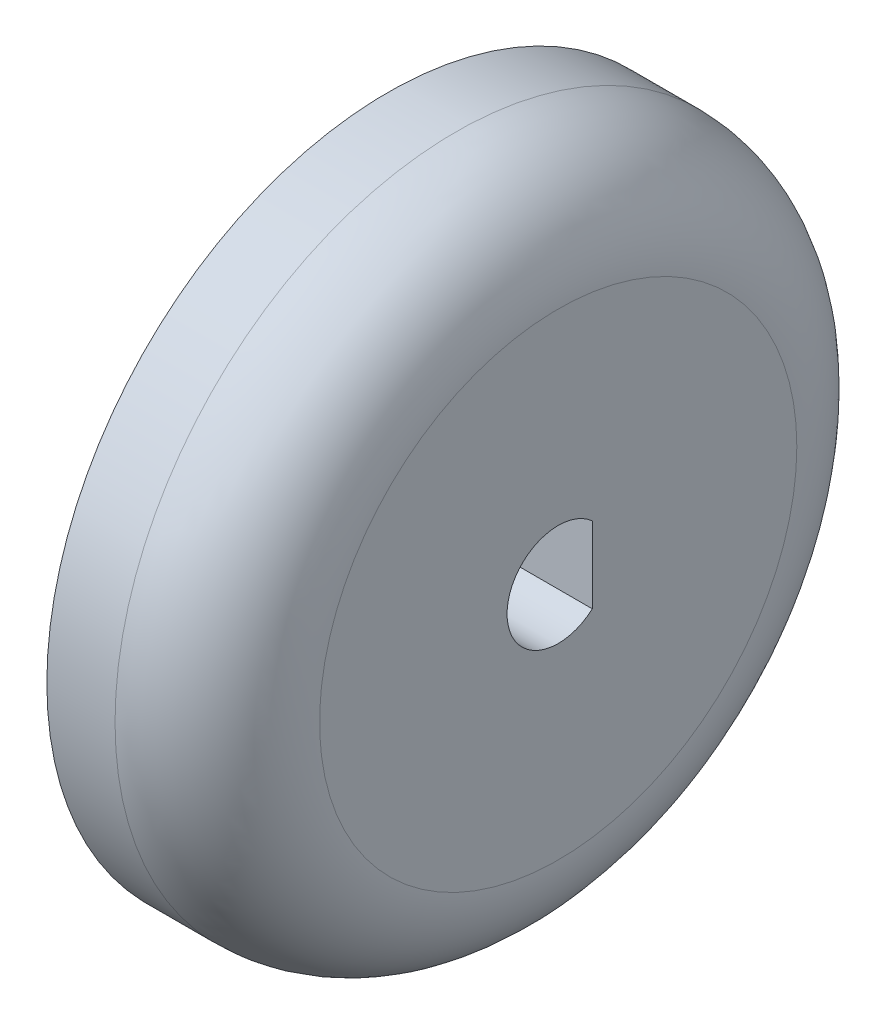
ISO-10303-21;
HEADER;
FILE_DESCRIPTION(('STEP AP214'),'2;1');
FILE_NAME('part.step','',(''),(''),'','','');
FILE_SCHEMA(('AUTOMOTIVE_DESIGN { 1 0 10303 214 1 1 1 1 }'));
ENDSEC;
DATA;
#1=APPLICATION_CONTEXT('core data for automotive mechanical design processes');
#2=APPLICATION_PROTOCOL_DEFINITION('international standard','automotive_design',2000,#1);
#3=PRODUCT_CONTEXT('',#1,'mechanical');
#4=PRODUCT('Part','Part','',(#3));
#5=PRODUCT_RELATED_PRODUCT_CATEGORY('part','',(#4));
#6=PRODUCT_DEFINITION_FORMATION('','',#4);
#7=PRODUCT_DEFINITION_CONTEXT('part definition',#1,'design');
#8=PRODUCT_DEFINITION('design','',#6,#7);
#9=PRODUCT_DEFINITION_SHAPE('','',#8);
#10=(LENGTH_UNIT() NAMED_UNIT(*) SI_UNIT(.MILLI.,.METRE.));
#11=(NAMED_UNIT(*) PLANE_ANGLE_UNIT() SI_UNIT($,.RADIAN.));
#12=(NAMED_UNIT(*) SI_UNIT($,.STERADIAN.) SOLID_ANGLE_UNIT());
#13=UNCERTAINTY_MEASURE_WITH_UNIT(LENGTH_MEASURE(1.E-05),#10,'distance_accuracy_value','');
#14=(GEOMETRIC_REPRESENTATION_CONTEXT(3) GLOBAL_UNCERTAINTY_ASSIGNED_CONTEXT((#13)) GLOBAL_UNIT_ASSIGNED_CONTEXT((#10,
#11,#12)) REPRESENTATION_CONTEXT('',''));
#15=CARTESIAN_POINT('',(0.,0.,0.));
#16=DIRECTION('',(0.,0.,1.));
#17=DIRECTION('',(1.,0.,0.));
#18=AXIS2_PLACEMENT_3D('',#15,#16,#17);
#19=CARTESIAN_POINT('',(10.,0.,0.));
#20=DIRECTION('',(-1.,0.,0.));
#21=DIRECTION('',(0.,0.,1.));
#22=AXIS2_PLACEMENT_3D('',#19,#20,#21);
#23=CYLINDRICAL_SURFACE('',#22,10.);
#24=CARTESIAN_POINT('',(7.,0.,0.));
#25=DIRECTION('',(1.,0.,0.));
#26=DIRECTION('',(0.,0.,-1.));
#27=AXIS2_PLACEMENT_3D('',#24,#25,#26);
#28=CIRCLE('',#27,10.);
#29=CARTESIAN_POINT('',(7.,0.,-10.));
#30=VERTEX_POINT('',#29);
#31=EDGE_CURVE('E65',#30,#30,#28,.F.);
#32=ORIENTED_EDGE('',*,*,#31,.T.);
#33=EDGE_LOOP('',(#32));
#34=FACE_BOUND('',#33,.T.);
#35=CARTESIAN_POINT('',(5.,0.,0.));
#36=DIRECTION('',(-1.,0.,0.));
#37=DIRECTION('',(0.,0.,1.));
#38=AXIS2_PLACEMENT_3D('',#35,#36,#37);
#39=CIRCLE('',#38,10.);
#40=CARTESIAN_POINT('',(5.,0.,10.));
#41=VERTEX_POINT('',#40);
#42=EDGE_CURVE('E12',#41,#41,#39,.T.);
#43=ORIENTED_EDGE('',*,*,#42,.F.);
#44=EDGE_LOOP('',(#43));
#45=FACE_BOUND('',#44,.T.);
#46=ADVANCED_FACE('F33',(#34,#45),#23,.T.);
#47=CARTESIAN_POINT('',(0.,0.,0.));
#48=DIRECTION('',(1.,0.,0.));
#49=DIRECTION('',(0.,1.,0.));
#50=AXIS2_PLACEMENT_3D('',#47,#48,#49);
#51=CYLINDRICAL_SURFACE('',#50,1.5);
#52=CARTESIAN_POINT('',(5.,0.,0.));
#53=DIRECTION('',(-1.,0.,0.));
#54=DIRECTION('',(0.,0.,1.));
#55=AXIS2_PLACEMENT_3D('',#52,#53,#54);
#56=CIRCLE('',#55,1.5);
#57=CARTESIAN_POINT('',(5.,1.1180339887499,-1.));
#58=VERTEX_POINT('',#57);
#59=CARTESIAN_POINT('',(5.,-1.1180339887499,-1.));
#60=VERTEX_POINT('',#59);
#61=EDGE_CURVE('E68',#58,#60,#56,.F.);
#62=ORIENTED_EDGE('',*,*,#61,.F.);
#63=DIRECTION('',(1.,0.,0.));
#64=VECTOR('',#63,1.);
#65=CARTESIAN_POINT('',(0.,1.11803398874989,-1.));
#66=LINE('',#65,#64);
#67=CARTESIAN_POINT('',(10.,1.1180339887499,-1.));
#68=VERTEX_POINT('',#67);
#69=EDGE_CURVE('E58',#58,#68,#66,.T.);
#70=ORIENTED_EDGE('',*,*,#69,.T.);
#71=CARTESIAN_POINT('',(10.,0.,0.));
#72=DIRECTION('',(1.,0.,0.));
#73=DIRECTION('',(0.,1.,0.));
#74=AXIS2_PLACEMENT_3D('',#71,#72,#73);
#75=CIRCLE('',#74,1.5);
#76=CARTESIAN_POINT('',(10.,-1.1180339887499,-1.));
#77=VERTEX_POINT('',#76);
#78=EDGE_CURVE('E71',#68,#77,#75,.T.);
#79=ORIENTED_EDGE('',*,*,#78,.T.);
#80=DIRECTION('',(1.,0.,0.));
#81=VECTOR('',#80,1.);
#82=CARTESIAN_POINT('',(0.,-1.1180339887499,-1.));
#83=LINE('',#82,#81);
#84=EDGE_CURVE('E52',#60,#77,#83,.T.);
#85=ORIENTED_EDGE('',*,*,#84,.F.);
#86=EDGE_LOOP('',(#62,#70,#79,#85));
#87=FACE_BOUND('',#86,.T.);
#88=ADVANCED_FACE('F69',(#87),#51,.F.);
#89=CARTESIAN_POINT('',(0.,1.11803398874989,-1.));
#90=DIRECTION('',(0.,0.,-1.));
#91=DIRECTION('',(-1.,0.,0.));
#92=AXIS2_PLACEMENT_3D('',#89,#90,#91);
#93=PLANE('',#92);
#94=DIRECTION('',(0.,1.,0.));
#95=VECTOR('',#94,1.);
#96=CARTESIAN_POINT('',(5.,1.11803398874989,-1.));
#97=LINE('',#96,#95);
#98=EDGE_CURVE('E37',#60,#58,#97,.T.);
#99=ORIENTED_EDGE('',*,*,#98,.F.);
#100=ORIENTED_EDGE('',*,*,#84,.T.);
#101=DIRECTION('',(0.,1.,0.));
#102=VECTOR('',#101,1.);
#103=CARTESIAN_POINT('',(10.,1.1180339887499,-1.));
#104=LINE('',#103,#102);
#105=EDGE_CURVE('E62',#77,#68,#104,.T.);
#106=ORIENTED_EDGE('',*,*,#105,.T.);
#107=ORIENTED_EDGE('',*,*,#69,.F.);
#108=EDGE_LOOP('',(#99,#100,#106,#107));
#109=FACE_BOUND('',#108,.T.);
#110=ADVANCED_FACE('F60',(#109),#93,.F.);
#111=CARTESIAN_POINT('',(10.,0.,0.));
#112=DIRECTION('',(1.,0.,0.));
#113=DIRECTION('',(0.,0.,-1.));
#114=AXIS2_PLACEMENT_3D('',#111,#112,#113);
#115=PLANE('',#114);
#116=CARTESIAN_POINT('',(10.,0.,0.));
#117=DIRECTION('',(1.,0.,0.));
#118=DIRECTION('',(0.,0.,-1.));
#119=AXIS2_PLACEMENT_3D('',#116,#117,#118);
#120=CIRCLE('',#119,7.);
#121=CARTESIAN_POINT('',(10.,0.,-7.));
#122=VERTEX_POINT('',#121);
#123=EDGE_CURVE('E75',#122,#122,#120,.T.);
#124=ORIENTED_EDGE('',*,*,#123,.T.);
#125=EDGE_LOOP('',(#124));
#126=FACE_BOUND('',#125,.T.);
#127=ORIENTED_EDGE('',*,*,#78,.F.);
#128=ORIENTED_EDGE('',*,*,#105,.F.);
#129=EDGE_LOOP('',(#127,#128));
#130=FACE_BOUND('',#129,.T.);
#131=ADVANCED_FACE('F85',(#126,#130),#115,.T.);
#132=CARTESIAN_POINT('',(7.,0.,0.));
#133=DIRECTION('',(1.,0.,0.));
#134=DIRECTION('',(0.,0.,-1.));
#135=AXIS2_PLACEMENT_3D('',#132,#133,#134);
#136=TOROIDAL_SURFACE('',#135,7.,3.);
#137=ORIENTED_EDGE('',*,*,#31,.F.);
#138=EDGE_LOOP('',(#137));
#139=FACE_BOUND('',#138,.T.);
#140=ORIENTED_EDGE('',*,*,#123,.F.);
#141=EDGE_LOOP('',(#140));
#142=FACE_BOUND('',#141,.T.);
#143=ADVANCED_FACE('F35',(#139,#142),#136,.T.);
#144=CARTESIAN_POINT('',(5.,0.,0.));
#145=DIRECTION('',(-1.,0.,0.));
#146=DIRECTION('',(0.,0.,1.));
#147=AXIS2_PLACEMENT_3D('',#144,#145,#146);
#148=PLANE('',#147);
#149=ORIENTED_EDGE('',*,*,#98,.T.);
#150=ORIENTED_EDGE('',*,*,#61,.T.);
#151=EDGE_LOOP('',(#149,#150));
#152=FACE_BOUND('',#151,.T.);
#153=ORIENTED_EDGE('',*,*,#42,.T.);
#154=EDGE_LOOP('',(#153));
#155=FACE_BOUND('',#154,.T.);
#156=ADVANCED_FACE('F73',(#152,#155),#148,.T.);
#157=CLOSED_SHELL('',(#46,#88,#110,#131,#143,#156));
#158=MANIFOLD_SOLID_BREP('B2',#157);
#159=ADVANCED_BREP_SHAPE_REPRESENTATION('',(#18,#158),#14);
#160=SHAPE_DEFINITION_REPRESENTATION(#9,#159);
ENDSEC;
END-ISO-10303-21;
